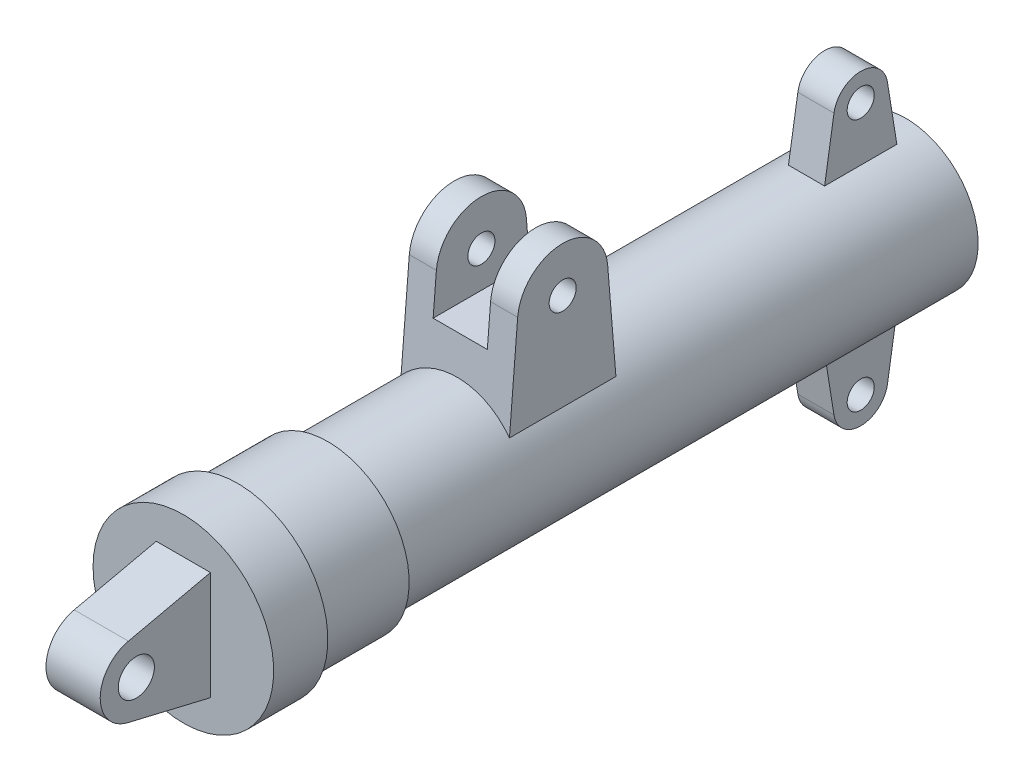
ISO-10303-21;
HEADER;
FILE_DESCRIPTION(('STEP AP214'),'2;1');
FILE_NAME('part.step','',(''),(''),'','','');
FILE_SCHEMA(('AUTOMOTIVE_DESIGN { 1 0 10303 214 1 1 1 1 }'));
ENDSEC;
DATA;
#1=APPLICATION_CONTEXT('core data for automotive mechanical design processes');
#2=APPLICATION_PROTOCOL_DEFINITION('international standard','automotive_design',2000,#1);
#3=PRODUCT_CONTEXT('',#1,'mechanical');
#4=PRODUCT('Part','Part','',(#3));
#5=PRODUCT_RELATED_PRODUCT_CATEGORY('part','',(#4));
#6=PRODUCT_DEFINITION_FORMATION('','',#4);
#7=PRODUCT_DEFINITION_CONTEXT('part definition',#1,'design');
#8=PRODUCT_DEFINITION('design','',#6,#7);
#9=PRODUCT_DEFINITION_SHAPE('','',#8);
#10=(LENGTH_UNIT() NAMED_UNIT(*) SI_UNIT(.MILLI.,.METRE.));
#11=(NAMED_UNIT(*) PLANE_ANGLE_UNIT() SI_UNIT($,.RADIAN.));
#12=(NAMED_UNIT(*) SI_UNIT($,.STERADIAN.) SOLID_ANGLE_UNIT());
#13=UNCERTAINTY_MEASURE_WITH_UNIT(LENGTH_MEASURE(1.E-05),#10,'distance_accuracy_value','');
#14=(GEOMETRIC_REPRESENTATION_CONTEXT(3) GLOBAL_UNCERTAINTY_ASSIGNED_CONTEXT((#13)) GLOBAL_UNIT_ASSIGNED_CONTEXT((#10,
#11,#12)) REPRESENTATION_CONTEXT('',''));
#15=CARTESIAN_POINT('',(0.,0.,0.));
#16=DIRECTION('',(0.,0.,1.));
#17=DIRECTION('',(1.,0.,0.));
#18=AXIS2_PLACEMENT_3D('',#15,#16,#17);
#19=CARTESIAN_POINT('',(10.,-70.,-13.0597014925373));
#20=DIRECTION('',(1.,0.,0.));
#21=DIRECTION('',(0.,0.,-1.));
#22=AXIS2_PLACEMENT_3D('',#19,#20,#21);
#23=PLANE('',#22);
#24=DIRECTION('',(0.,0.,-1.));
#25=VECTOR('',#24,1.);
#26=CARTESIAN_POINT('',(10.,-40.,6.94029850746271));
#27=LINE('',#26,#25);
#28=CARTESIAN_POINT('',(10.,-40.,6.94029850746271));
#29=VERTEX_POINT('',#28);
#30=CARTESIAN_POINT('',(10.,-40.,-33.0597014925373));
#31=VERTEX_POINT('',#30);
#32=EDGE_CURVE('E138',#29,#31,#27,.T.);
#33=ORIENTED_EDGE('',*,*,#32,.F.);
#34=DIRECTION('',(0.,-0.987396752804077,-0.158264501869385));
#35=VECTOR('',#34,1.);
#36=CARTESIAN_POINT('',(10.,-40.,6.94029850746271));
#37=LINE('',#36,#35);
#38=CARTESIAN_POINT('',(10.,-72.3739675280408,1.75124979952386));
#39=VERTEX_POINT('',#38);
#40=EDGE_CURVE('E137',#29,#39,#37,.T.);
#41=ORIENTED_EDGE('',*,*,#40,.T.);
#42=CARTESIAN_POINT('',(10.,-70.,-13.0597014925373));
#43=DIRECTION('',(-1.,0.,0.));
#44=DIRECTION('',(0.,0.,-1.));
#45=AXIS2_PLACEMENT_3D('',#42,#43,#44);
#46=CIRCLE('',#45,15.);
#47=CARTESIAN_POINT('',(10.,-72.3739675280408,-27.8706527845985));
#48=VERTEX_POINT('',#47);
#49=EDGE_CURVE('E130',#48,#39,#46,.T.);
#50=ORIENTED_EDGE('',*,*,#49,.F.);
#51=DIRECTION('',(0.,-0.987396752804077,0.158264501869385));
#52=VECTOR('',#51,1.);
#53=CARTESIAN_POINT('',(10.,-40.,-33.0597014925373));
#54=LINE('',#53,#52);
#55=EDGE_CURVE('E135',#31,#48,#54,.T.);
#56=ORIENTED_EDGE('',*,*,#55,.F.);
#57=EDGE_LOOP('',(#33,#41,#50,#56));
#58=FACE_BOUND('',#57,.T.);
#59=CARTESIAN_POINT('',(10.,-70.,-13.0597014925373));
#60=DIRECTION('',(-1.,0.,0.));
#61=DIRECTION('',(0.,0.,-1.));
#62=AXIS2_PLACEMENT_3D('',#59,#60,#61);
#63=CIRCLE('',#62,7.5);
#64=CARTESIAN_POINT('',(10.,-70.,-20.5597014925373));
#65=VERTEX_POINT('',#64);
#66=EDGE_CURVE('E146',#65,#65,#63,.T.);
#67=ORIENTED_EDGE('',*,*,#66,.T.);
#68=EDGE_LOOP('',(#67));
#69=FACE_BOUND('',#68,.T.);
#70=ADVANCED_FACE('F79',(#58,#69),#23,.T.);
#71=CARTESIAN_POINT('',(-10.,-70.,-13.0597014925373));
#72=DIRECTION('',(1.,0.,0.));
#73=DIRECTION('',(0.,0.,-1.));
#74=AXIS2_PLACEMENT_3D('',#71,#72,#73);
#75=PLANE('',#74);
#76=DIRECTION('',(0.,0.,-1.));
#77=VECTOR('',#76,1.);
#78=CARTESIAN_POINT('',(-10.,-40.,6.94029850746271));
#79=LINE('',#78,#77);
#80=CARTESIAN_POINT('',(-10.,-40.,6.94029850746271));
#81=VERTEX_POINT('',#80);
#82=CARTESIAN_POINT('',(-10.,-40.,-33.0597014925373));
#83=VERTEX_POINT('',#82);
#84=EDGE_CURVE('E145',#81,#83,#79,.T.);
#85=ORIENTED_EDGE('',*,*,#84,.T.);
#86=DIRECTION('',(0.,-0.987396752804077,0.158264501869385));
#87=VECTOR('',#86,1.);
#88=CARTESIAN_POINT('',(-10.,-40.,-33.0597014925373));
#89=LINE('',#88,#87);
#90=CARTESIAN_POINT('',(-10.,-72.3739675280408,-27.8706527845985));
#91=VERTEX_POINT('',#90);
#92=EDGE_CURVE('E150',#83,#91,#89,.T.);
#93=ORIENTED_EDGE('',*,*,#92,.T.);
#94=CARTESIAN_POINT('',(-10.,-70.,-13.0597014925373));
#95=DIRECTION('',(-1.,0.,0.));
#96=DIRECTION('',(0.,0.,-1.));
#97=AXIS2_PLACEMENT_3D('',#94,#95,#96);
#98=CIRCLE('',#97,15.);
#99=CARTESIAN_POINT('',(-10.,-72.3739675280408,1.75124979952386));
#100=VERTEX_POINT('',#99);
#101=EDGE_CURVE('E128',#91,#100,#98,.T.);
#102=ORIENTED_EDGE('',*,*,#101,.T.);
#103=DIRECTION('',(0.,-0.987396752804077,-0.158264501869385));
#104=VECTOR('',#103,1.);
#105=CARTESIAN_POINT('',(-10.,-40.,6.94029850746271));
#106=LINE('',#105,#104);
#107=EDGE_CURVE('E151',#81,#100,#106,.T.);
#108=ORIENTED_EDGE('',*,*,#107,.F.);
#109=EDGE_LOOP('',(#85,#93,#102,#108));
#110=FACE_BOUND('',#109,.T.);
#111=CARTESIAN_POINT('',(-10.,-70.,-13.0597014925373));
#112=DIRECTION('',(-1.,0.,0.));
#113=DIRECTION('',(0.,0.,-1.));
#114=AXIS2_PLACEMENT_3D('',#111,#112,#113);
#115=CIRCLE('',#114,7.5);
#116=CARTESIAN_POINT('',(-10.,-70.,-20.5597014925373));
#117=VERTEX_POINT('',#116);
#118=EDGE_CURVE('E154',#117,#117,#115,.T.);
#119=ORIENTED_EDGE('',*,*,#118,.F.);
#120=EDGE_LOOP('',(#119));
#121=FACE_BOUND('',#120,.T.);
#122=ADVANCED_FACE('F169',(#110,#121),#75,.F.);
#123=CARTESIAN_POINT('',(10.,-40.,6.94029850746271));
#124=DIRECTION('',(0.,-1.,0.));
#125=DIRECTION('',(0.,0.,1.));
#126=AXIS2_PLACEMENT_3D('',#123,#124,#125);
#127=PLANE('',#126);
#128=ORIENTED_EDGE('',*,*,#84,.F.);
#129=DIRECTION('',(-1.,0.,0.));
#130=VECTOR('',#129,1.);
#131=CARTESIAN_POINT('',(10.,-40.,6.94029850746271));
#132=LINE('',#131,#130);
#133=EDGE_CURVE('E100',#29,#81,#132,.T.);
#134=ORIENTED_EDGE('',*,*,#133,.F.);
#135=ORIENTED_EDGE('',*,*,#32,.T.);
#136=DIRECTION('',(-1.,0.,0.));
#137=VECTOR('',#136,1.);
#138=CARTESIAN_POINT('',(10.,-40.,-33.0597014925373));
#139=LINE('',#138,#137);
#140=EDGE_CURVE('E13',#31,#83,#139,.T.);
#141=ORIENTED_EDGE('',*,*,#140,.T.);
#142=EDGE_LOOP('',(#128,#134,#135,#141));
#143=FACE_BOUND('',#142,.T.);
#144=ADVANCED_FACE('F85',(#143),#127,.F.);
#145=CARTESIAN_POINT('',(10.,-40.,-33.0597014925373));
#146=DIRECTION('',(0.,0.158264501869385,0.987396752804077));
#147=DIRECTION('',(0.,0.987396752804077,-0.158264501869385));
#148=AXIS2_PLACEMENT_3D('',#145,#146,#147);
#149=PLANE('',#148);
#150=ORIENTED_EDGE('',*,*,#92,.F.);
#151=ORIENTED_EDGE('',*,*,#140,.F.);
#152=ORIENTED_EDGE('',*,*,#55,.T.);
#153=DIRECTION('',(-1.,0.,0.));
#154=VECTOR('',#153,1.);
#155=CARTESIAN_POINT('',(10.,-72.3739675280408,-27.8706527845985));
#156=LINE('',#155,#154);
#157=EDGE_CURVE('E90',#48,#91,#156,.T.);
#158=ORIENTED_EDGE('',*,*,#157,.T.);
#159=EDGE_LOOP('',(#150,#151,#152,#158));
#160=FACE_BOUND('',#159,.T.);
#161=ADVANCED_FACE('F132',(#160),#149,.F.);
#162=CARTESIAN_POINT('',(10.,-70.,-13.0597014925373));
#163=DIRECTION('',(-1.,0.,0.));
#164=DIRECTION('',(0.,0.,1.));
#165=AXIS2_PLACEMENT_3D('',#162,#163,#164);
#166=CYLINDRICAL_SURFACE('',#165,15.);
#167=ORIENTED_EDGE('',*,*,#101,.F.);
#168=ORIENTED_EDGE('',*,*,#157,.F.);
#169=ORIENTED_EDGE('',*,*,#49,.T.);
#170=DIRECTION('',(-1.,0.,0.));
#171=VECTOR('',#170,1.);
#172=CARTESIAN_POINT('',(10.,-72.3739675280408,1.75124979952386));
#173=LINE('',#172,#171);
#174=EDGE_CURVE('E114',#39,#100,#173,.T.);
#175=ORIENTED_EDGE('',*,*,#174,.T.);
#176=EDGE_LOOP('',(#167,#168,#169,#175));
#177=FACE_BOUND('',#176,.T.);
#178=ADVANCED_FACE('F124',(#177),#166,.T.);
#179=CARTESIAN_POINT('',(10.,-40.,6.94029850746271));
#180=DIRECTION('',(0.,-0.158264501869385,0.987396752804077));
#181=DIRECTION('',(0.,0.987396752804077,0.158264501869385));
#182=AXIS2_PLACEMENT_3D('',#179,#180,#181);
#183=PLANE('',#182);
#184=ORIENTED_EDGE('',*,*,#107,.T.);
#185=ORIENTED_EDGE('',*,*,#174,.F.);
#186=ORIENTED_EDGE('',*,*,#40,.F.);
#187=ORIENTED_EDGE('',*,*,#133,.T.);
#188=EDGE_LOOP('',(#184,#185,#186,#187));
#189=FACE_BOUND('',#188,.T.);
#190=ADVANCED_FACE('F163',(#189),#183,.T.);
#191=CARTESIAN_POINT('',(10.,-70.,-13.0597014925373));
#192=DIRECTION('',(-1.,0.,0.));
#193=DIRECTION('',(0.,0.,1.));
#194=AXIS2_PLACEMENT_3D('',#191,#192,#193);
#195=CYLINDRICAL_SURFACE('',#194,7.5);
#196=ORIENTED_EDGE('',*,*,#66,.F.);
#197=EDGE_LOOP('',(#196));
#198=FACE_BOUND('',#197,.T.);
#199=ORIENTED_EDGE('',*,*,#118,.T.);
#200=EDGE_LOOP('',(#199));
#201=FACE_BOUND('',#200,.T.);
#202=ADVANCED_FACE('F161',(#198,#201),#195,.F.);
#203=CLOSED_SHELL('',(#70,#122,#144,#161,#178,#190,#202));
#204=MANIFOLD_SOLID_BREP('B2',#203);
#205=CARTESIAN_POINT('',(10.,70.,-13.0597014925373));
#206=DIRECTION('',(1.,0.,0.));
#207=DIRECTION('',(0.,0.,-1.));
#208=AXIS2_PLACEMENT_3D('',#205,#206,#207);
#209=PLANE('',#208);
#210=DIRECTION('',(0.,0.,-1.));
#211=VECTOR('',#210,1.);
#212=CARTESIAN_POINT('',(10.,40.,6.94029850746271));
#213=LINE('',#212,#211);
#214=CARTESIAN_POINT('',(10.,40.,6.94029850746271));
#215=VERTEX_POINT('',#214);
#216=CARTESIAN_POINT('',(10.,40.,-33.0597014925373));
#217=VERTEX_POINT('',#216);
#218=EDGE_CURVE('E283',#215,#217,#213,.T.);
#219=ORIENTED_EDGE('',*,*,#218,.T.);
#220=DIRECTION('',(0.,0.987396752804077,0.158264501869385));
#221=VECTOR('',#220,1.);
#222=CARTESIAN_POINT('',(10.,40.,-33.0597014925373));
#223=LINE('',#222,#221);
#224=CARTESIAN_POINT('',(10.,72.3739675280408,-27.8706527845985));
#225=VERTEX_POINT('',#224);
#226=EDGE_CURVE('E280',#217,#225,#223,.T.);
#227=ORIENTED_EDGE('',*,*,#226,.T.);
#228=CARTESIAN_POINT('',(10.,70.,-13.0597014925373));
#229=DIRECTION('',(1.,0.,0.));
#230=DIRECTION('',(0.,0.,-1.));
#231=AXIS2_PLACEMENT_3D('',#228,#229,#230);
#232=CIRCLE('',#231,15.);
#233=CARTESIAN_POINT('',(10.,72.3739675280408,1.75124979952386));
#234=VERTEX_POINT('',#233);
#235=EDGE_CURVE('E282',#225,#234,#232,.T.);
#236=ORIENTED_EDGE('',*,*,#235,.T.);
#237=DIRECTION('',(0.,0.987396752804077,-0.158264501869385));
#238=VECTOR('',#237,1.);
#239=CARTESIAN_POINT('',(10.,40.,6.94029850746271));
#240=LINE('',#239,#238);
#241=EDGE_CURVE('E291',#215,#234,#240,.T.);
#242=ORIENTED_EDGE('',*,*,#241,.F.);
#243=EDGE_LOOP('',(#219,#227,#236,#242));
#244=FACE_BOUND('',#243,.T.);
#245=CARTESIAN_POINT('',(10.,70.,-13.0597014925373));
#246=DIRECTION('',(1.,0.,0.));
#247=DIRECTION('',(0.,0.,-1.));
#248=AXIS2_PLACEMENT_3D('',#245,#246,#247);
#249=CIRCLE('',#248,7.5);
#250=CARTESIAN_POINT('',(10.,70.,-20.5597014925373));
#251=VERTEX_POINT('',#250);
#252=EDGE_CURVE('E299',#251,#251,#249,.T.);
#253=ORIENTED_EDGE('',*,*,#252,.F.);
#254=EDGE_LOOP('',(#253));
#255=FACE_BOUND('',#254,.T.);
#256=ADVANCED_FACE('F232',(#244,#255),#209,.T.);
#257=CARTESIAN_POINT('',(-10.,70.,-13.0597014925373));
#258=DIRECTION('',(1.,0.,0.));
#259=DIRECTION('',(0.,0.,-1.));
#260=AXIS2_PLACEMENT_3D('',#257,#258,#259);
#261=PLANE('',#260);
#262=DIRECTION('',(0.,0.,-1.));
#263=VECTOR('',#262,1.);
#264=CARTESIAN_POINT('',(-10.,40.,6.94029850746271));
#265=LINE('',#264,#263);
#266=CARTESIAN_POINT('',(-10.,40.,6.94029850746271));
#267=VERTEX_POINT('',#266);
#268=CARTESIAN_POINT('',(-10.,40.,-33.0597014925373));
#269=VERTEX_POINT('',#268);
#270=EDGE_CURVE('E297',#267,#269,#265,.T.);
#271=ORIENTED_EDGE('',*,*,#270,.F.);
#272=DIRECTION('',(0.,0.987396752804077,-0.158264501869385));
#273=VECTOR('',#272,1.);
#274=CARTESIAN_POINT('',(-10.,40.,6.94029850746271));
#275=LINE('',#274,#273);
#276=CARTESIAN_POINT('',(-10.,72.3739675280408,1.75124979952386));
#277=VERTEX_POINT('',#276);
#278=EDGE_CURVE('E302',#267,#277,#275,.T.);
#279=ORIENTED_EDGE('',*,*,#278,.T.);
#280=CARTESIAN_POINT('',(-10.,70.,-13.0597014925373));
#281=DIRECTION('',(1.,0.,0.));
#282=DIRECTION('',(0.,0.,-1.));
#283=AXIS2_PLACEMENT_3D('',#280,#281,#282);
#284=CIRCLE('',#283,15.);
#285=CARTESIAN_POINT('',(-10.,72.3739675280408,-27.8706527845985));
#286=VERTEX_POINT('',#285);
#287=EDGE_CURVE('E305',#286,#277,#284,.T.);
#288=ORIENTED_EDGE('',*,*,#287,.F.);
#289=DIRECTION('',(0.,0.987396752804077,0.158264501869385));
#290=VECTOR('',#289,1.);
#291=CARTESIAN_POINT('',(-10.,40.,-33.0597014925373));
#292=LINE('',#291,#290);
#293=EDGE_CURVE('E287',#269,#286,#292,.T.);
#294=ORIENTED_EDGE('',*,*,#293,.F.);
#295=EDGE_LOOP('',(#271,#279,#288,#294));
#296=FACE_BOUND('',#295,.T.);
#297=CARTESIAN_POINT('',(-10.,70.,-13.0597014925373));
#298=DIRECTION('',(1.,0.,0.));
#299=DIRECTION('',(0.,0.,-1.));
#300=AXIS2_PLACEMENT_3D('',#297,#298,#299);
#301=CIRCLE('',#300,7.5);
#302=CARTESIAN_POINT('',(-10.,70.,-20.5597014925373));
#303=VERTEX_POINT('',#302);
#304=EDGE_CURVE('E309',#303,#303,#301,.T.);
#305=ORIENTED_EDGE('',*,*,#304,.T.);
#306=EDGE_LOOP('',(#305));
#307=FACE_BOUND('',#306,.T.);
#308=ADVANCED_FACE('F317',(#296,#307),#261,.F.);
#309=CARTESIAN_POINT('',(10.,40.,6.94029850746271));
#310=DIRECTION('',(0.,1.,0.));
#311=DIRECTION('',(0.,0.,1.));
#312=AXIS2_PLACEMENT_3D('',#309,#310,#311);
#313=PLANE('',#312);
#314=ORIENTED_EDGE('',*,*,#270,.T.);
#315=DIRECTION('',(-1.,0.,0.));
#316=VECTOR('',#315,1.);
#317=CARTESIAN_POINT('',(10.,40.,-33.0597014925373));
#318=LINE('',#317,#316);
#319=EDGE_CURVE('E77',#217,#269,#318,.T.);
#320=ORIENTED_EDGE('',*,*,#319,.F.);
#321=ORIENTED_EDGE('',*,*,#218,.F.);
#322=DIRECTION('',(-1.,0.,0.));
#323=VECTOR('',#322,1.);
#324=CARTESIAN_POINT('',(10.,40.,6.94029850746271));
#325=LINE('',#324,#323);
#326=EDGE_CURVE('E253',#215,#267,#325,.T.);
#327=ORIENTED_EDGE('',*,*,#326,.T.);
#328=EDGE_LOOP('',(#314,#320,#321,#327));
#329=FACE_BOUND('',#328,.T.);
#330=ADVANCED_FACE('F237',(#329),#313,.F.);
#331=CARTESIAN_POINT('',(10.,40.,-33.0597014925373));
#332=DIRECTION('',(0.,-0.158264501869385,0.987396752804077));
#333=DIRECTION('',(0.,-0.987396752804077,-0.158264501869385));
#334=AXIS2_PLACEMENT_3D('',#331,#332,#333);
#335=PLANE('',#334);
#336=ORIENTED_EDGE('',*,*,#293,.T.);
#337=DIRECTION('',(-1.,0.,0.));
#338=VECTOR('',#337,1.);
#339=CARTESIAN_POINT('',(10.,72.3739675280408,-27.8706527845985));
#340=LINE('',#339,#338);
#341=EDGE_CURVE('E242',#225,#286,#340,.T.);
#342=ORIENTED_EDGE('',*,*,#341,.F.);
#343=ORIENTED_EDGE('',*,*,#226,.F.);
#344=ORIENTED_EDGE('',*,*,#319,.T.);
#345=EDGE_LOOP('',(#336,#342,#343,#344));
#346=FACE_BOUND('',#345,.T.);
#347=ADVANCED_FACE('F286',(#346),#335,.F.);
#348=CARTESIAN_POINT('',(10.,70.,-13.0597014925373));
#349=DIRECTION('',(-1.,0.,0.));
#350=DIRECTION('',(0.,0.,1.));
#351=AXIS2_PLACEMENT_3D('',#348,#349,#350);
#352=CYLINDRICAL_SURFACE('',#351,15.);
#353=ORIENTED_EDGE('',*,*,#287,.T.);
#354=DIRECTION('',(-1.,0.,0.));
#355=VECTOR('',#354,1.);
#356=CARTESIAN_POINT('',(10.,72.3739675280408,1.75124979952386));
#357=LINE('',#356,#355);
#358=EDGE_CURVE('E266',#234,#277,#357,.T.);
#359=ORIENTED_EDGE('',*,*,#358,.F.);
#360=ORIENTED_EDGE('',*,*,#235,.F.);
#361=ORIENTED_EDGE('',*,*,#341,.T.);
#362=EDGE_LOOP('',(#353,#359,#360,#361));
#363=FACE_BOUND('',#362,.T.);
#364=ADVANCED_FACE('F295',(#363),#352,.T.);
#365=CARTESIAN_POINT('',(10.,40.,6.94029850746271));
#366=DIRECTION('',(0.,0.158264501869385,0.987396752804077));
#367=DIRECTION('',(0.,-0.987396752804077,0.158264501869385));
#368=AXIS2_PLACEMENT_3D('',#365,#366,#367);
#369=PLANE('',#368);
#370=ORIENTED_EDGE('',*,*,#278,.F.);
#371=ORIENTED_EDGE('',*,*,#326,.F.);
#372=ORIENTED_EDGE('',*,*,#241,.T.);
#373=ORIENTED_EDGE('',*,*,#358,.T.);
#374=EDGE_LOOP('',(#370,#371,#372,#373));
#375=FACE_BOUND('',#374,.T.);
#376=ADVANCED_FACE('F330',(#375),#369,.T.);
#377=CARTESIAN_POINT('',(10.,70.,-13.0597014925373));
#378=DIRECTION('',(-1.,0.,0.));
#379=DIRECTION('',(0.,0.,1.));
#380=AXIS2_PLACEMENT_3D('',#377,#378,#379);
#381=CYLINDRICAL_SURFACE('',#380,7.5);
#382=ORIENTED_EDGE('',*,*,#252,.T.);
#383=EDGE_LOOP('',(#382));
#384=FACE_BOUND('',#383,.T.);
#385=ORIENTED_EDGE('',*,*,#304,.F.);
#386=EDGE_LOOP('',(#385));
#387=FACE_BOUND('',#386,.T.);
#388=ADVANCED_FACE('F316',(#384,#387),#381,.F.);
#389=CLOSED_SHELL('',(#256,#308,#330,#347,#364,#376,#388));
#390=MANIFOLD_SOLID_BREP('B7',#389);
#391=CARTESIAN_POINT('',(30.,20.,141.940298507463));
#392=DIRECTION('',(0.,-0.0816633199329574,0.996659973199249));
#393=DIRECTION('',(0.,-0.996659973199249,-0.0816633199329574));
#394=AXIS2_PLACEMENT_3D('',#391,#392,#393);
#395=PLANE('',#394);
#396=DIRECTION('',(0.,0.996659973199249,0.0816633199329574));
#397=VECTOR('',#396,1.);
#398=CARTESIAN_POINT('',(-15.,20.,141.940298507463));
#399=LINE('',#398,#397);
#400=CARTESIAN_POINT('',(-15.,60.,145.217778174709));
#401=VERTEX_POINT('',#400);
#402=CARTESIAN_POINT('',(-15.,82.0415829983239,147.023799177481));
#403=VERTEX_POINT('',#402);
#404=EDGE_CURVE('E510',#401,#403,#399,.T.);
#405=ORIENTED_EDGE('',*,*,#404,.F.);
#406=DIRECTION('',(1.,0.,0.));
#407=VECTOR('',#406,1.);
#408=CARTESIAN_POINT('',(30.,60.,145.217778174709));
#409=LINE('',#408,#407);
#410=CARTESIAN_POINT('',(15.,60.,145.217778174709));
#411=VERTEX_POINT('',#410);
#412=EDGE_CURVE('E507',#401,#411,#409,.T.);
#413=ORIENTED_EDGE('',*,*,#412,.T.);
#414=DIRECTION('',(0.,0.996659973199249,0.0816633199329574));
#415=VECTOR('',#414,1.);
#416=CARTESIAN_POINT('',(15.,20.,141.940298507463));
#417=LINE('',#416,#415);
#418=CARTESIAN_POINT('',(15.,82.0415829983239,147.023799177481));
#419=VERTEX_POINT('',#418);
#420=EDGE_CURVE('E489',#411,#419,#417,.T.);
#421=ORIENTED_EDGE('',*,*,#420,.T.);
#422=DIRECTION('',(-1.,0.,0.));
#423=VECTOR('',#422,1.);
#424=CARTESIAN_POINT('',(30.,82.0415829983239,147.023799177481));
#425=LINE('',#424,#423);
#426=CARTESIAN_POINT('',(30.,82.0415829983239,147.023799177481));
#427=VERTEX_POINT('',#426);
#428=EDGE_CURVE('E538',#427,#419,#425,.T.);
#429=ORIENTED_EDGE('',*,*,#428,.F.);
#430=DIRECTION('',(0.,0.996659973199249,0.0816633199329574));
#431=VECTOR('',#430,1.);
#432=CARTESIAN_POINT('',(30.,20.,141.940298507463));
#433=LINE('',#432,#431);
#434=CARTESIAN_POINT('',(30.,26.4575131106459,142.469407705491));
#435=VERTEX_POINT('',#434);
#436=EDGE_CURVE('E522',#435,#427,#433,.T.);
#437=ORIENTED_EDGE('',*,*,#436,.F.);
#438=CARTESIAN_POINT('',(0.,0.,140.30155867384));
#439=DIRECTION('',(0.,-0.0816633199329574,0.996659973199249));
#440=DIRECTION('',(0.,-0.996659973199249,-0.0816633199329574));
#441=AXIS2_PLACEMENT_3D('',#438,#439,#440);
#442=ELLIPSE('',#441,40.13404879861,40.);
#443=CARTESIAN_POINT('',(-30.,26.4575131106459,142.469407705491));
#444=VERTEX_POINT('',#443);
#445=EDGE_CURVE('E405',#444,#435,#442,.F.);
#446=ORIENTED_EDGE('',*,*,#445,.F.);
#447=DIRECTION('',(0.,0.996659973199249,0.0816633199329574));
#448=VECTOR('',#447,1.);
#449=CARTESIAN_POINT('',(-30.,20.,141.940298507463));
#450=LINE('',#449,#448);
#451=CARTESIAN_POINT('',(-30.,82.0415829983239,147.023799177481));
#452=VERTEX_POINT('',#451);
#453=EDGE_CURVE('E523',#444,#452,#450,.T.);
#454=ORIENTED_EDGE('',*,*,#453,.T.);
#455=EDGE_CURVE('E541',#403,#452,#425,.T.);
#456=ORIENTED_EDGE('',*,*,#455,.F.);
#457=EDGE_LOOP('',(#405,#413,#421,#429,#437,#446,#454,#456));
#458=FACE_BOUND('',#457,.T.);
#459=ADVANCED_FACE('F377',(#458),#395,.F.);
#460=CARTESIAN_POINT('',(30.,20.,201.940298507463));
#461=DIRECTION('',(0.,0.0816633199329574,0.996659973199249));
#462=DIRECTION('',(0.,-0.996659973199249,0.0816633199329574));
#463=AXIS2_PLACEMENT_3D('',#460,#461,#462);
#464=PLANE('',#463);
#465=DIRECTION('',(1.,0.,0.));
#466=VECTOR('',#465,1.);
#467=CARTESIAN_POINT('',(30.,60.,198.662818840217));
#468=LINE('',#467,#466);
#469=CARTESIAN_POINT('',(-15.,60.,198.662818840217));
#470=VERTEX_POINT('',#469);
#471=CARTESIAN_POINT('',(15.,60.,198.662818840217));
#472=VERTEX_POINT('',#471);
#473=EDGE_CURVE('E235',#470,#472,#468,.T.);
#474=ORIENTED_EDGE('',*,*,#473,.F.);
#475=DIRECTION('',(0.,0.996659973199249,-0.0816633199329574));
#476=VECTOR('',#475,1.);
#477=CARTESIAN_POINT('',(-15.,20.,201.940298507463));
#478=LINE('',#477,#476);
#479=CARTESIAN_POINT('',(-15.,82.0415829983239,196.856797837444));
#480=VERTEX_POINT('',#479);
#481=EDGE_CURVE('E504',#470,#480,#478,.T.);
#482=ORIENTED_EDGE('',*,*,#481,.T.);
#483=DIRECTION('',(-1.,0.,0.));
#484=VECTOR('',#483,1.);
#485=CARTESIAN_POINT('',(30.,82.0415829983239,196.856797837444));
#486=LINE('',#485,#484);
#487=CARTESIAN_POINT('',(-30.,82.0415829983239,196.856797837444));
#488=VERTEX_POINT('',#487);
#489=EDGE_CURVE('E543',#480,#488,#486,.T.);
#490=ORIENTED_EDGE('',*,*,#489,.T.);
#491=DIRECTION('',(0.,0.996659973199249,-0.0816633199329574));
#492=VECTOR('',#491,1.);
#493=CARTESIAN_POINT('',(-30.,20.,201.940298507463));
#494=LINE('',#493,#492);
#495=CARTESIAN_POINT('',(-30.,26.4575131106459,201.411189309435));
#496=VERTEX_POINT('',#495);
#497=EDGE_CURVE('E513',#496,#488,#494,.T.);
#498=ORIENTED_EDGE('',*,*,#497,.F.);
#499=CARTESIAN_POINT('',(0.,0.,203.579038341086));
#500=DIRECTION('',(0.,0.0816633199329574,0.996659973199249));
#501=DIRECTION('',(0.,0.996659973199249,-0.0816633199329574));
#502=AXIS2_PLACEMENT_3D('',#499,#500,#501);
#503=ELLIPSE('',#502,40.13404879861,40.);
#504=CARTESIAN_POINT('',(30.,26.4575131106459,201.411189309435));
#505=VERTEX_POINT('',#504);
#506=EDGE_CURVE('E540',#496,#505,#503,.F.);
#507=ORIENTED_EDGE('',*,*,#506,.T.);
#508=DIRECTION('',(0.,0.996659973199249,-0.0816633199329574));
#509=VECTOR('',#508,1.);
#510=CARTESIAN_POINT('',(30.,20.,201.940298507463));
#511=LINE('',#510,#509);
#512=CARTESIAN_POINT('',(30.,82.0415829983239,196.856797837444));
#513=VERTEX_POINT('',#512);
#514=EDGE_CURVE('E517',#505,#513,#511,.T.);
#515=ORIENTED_EDGE('',*,*,#514,.T.);
#516=CARTESIAN_POINT('',(15.,82.0415829983239,196.856797837444));
#517=VERTEX_POINT('',#516);
#518=EDGE_CURVE('E494',#513,#517,#486,.T.);
#519=ORIENTED_EDGE('',*,*,#518,.T.);
#520=DIRECTION('',(0.,0.996659973199249,-0.0816633199329574));
#521=VECTOR('',#520,1.);
#522=CARTESIAN_POINT('',(15.,20.,201.940298507463));
#523=LINE('',#522,#521);
#524=EDGE_CURVE('E393',#472,#517,#523,.T.);
#525=ORIENTED_EDGE('',*,*,#524,.F.);
#526=EDGE_LOOP('',(#474,#482,#490,#498,#507,#515,#519,#525));
#527=FACE_BOUND('',#526,.T.);
#528=ADVANCED_FACE('F492',(#527),#464,.T.);
#529=CARTESIAN_POINT('',(30.,80.,171.940298507463));
#530=DIRECTION('',(-1.,0.,0.));
#531=DIRECTION('',(0.,0.,1.));
#532=AXIS2_PLACEMENT_3D('',#529,#530,#531);
#533=CYLINDRICAL_SURFACE('',#532,25.);
#534=CARTESIAN_POINT('',(-15.,80.,171.940298507463));
#535=DIRECTION('',(1.,0.,0.));
#536=DIRECTION('',(0.,0.,-1.));
#537=AXIS2_PLACEMENT_3D('',#534,#535,#536);
#538=CIRCLE('',#537,25.);
#539=EDGE_CURVE('E502',#403,#480,#538,.T.);
#540=ORIENTED_EDGE('',*,*,#539,.F.);
#541=ORIENTED_EDGE('',*,*,#455,.T.);
#542=CARTESIAN_POINT('',(-30.,80.,171.940298507463));
#543=DIRECTION('',(1.,0.,0.));
#544=DIRECTION('',(0.,0.,-1.));
#545=AXIS2_PLACEMENT_3D('',#542,#543,#544);
#546=CIRCLE('',#545,25.);
#547=EDGE_CURVE('E530',#452,#488,#546,.T.);
#548=ORIENTED_EDGE('',*,*,#547,.T.);
#549=ORIENTED_EDGE('',*,*,#489,.F.);
#550=EDGE_LOOP('',(#540,#541,#548,#549));
#551=FACE_BOUND('',#550,.T.);
#552=ADVANCED_FACE('F641',(#551),#533,.T.);
#553=CARTESIAN_POINT('',(30.,80.,171.940298507463));
#554=DIRECTION('',(-1.,0.,0.));
#555=DIRECTION('',(0.,0.,1.));
#556=AXIS2_PLACEMENT_3D('',#553,#554,#555);
#557=CYLINDRICAL_SURFACE('',#556,7.50000000000001);
#558=CARTESIAN_POINT('',(-30.,80.,171.940298507463));
#559=DIRECTION('',(1.,0.,0.));
#560=DIRECTION('',(0.,0.,-1.));
#561=AXIS2_PLACEMENT_3D('',#558,#559,#560);
#562=CIRCLE('',#561,7.50000000000001);
#563=CARTESIAN_POINT('',(-30.,80.,164.440298507463));
#564=VERTEX_POINT('',#563);
#565=EDGE_CURVE('E512',#564,#564,#562,.T.);
#566=ORIENTED_EDGE('',*,*,#565,.F.);
#567=EDGE_LOOP('',(#566));
#568=FACE_BOUND('',#567,.T.);
#569=CARTESIAN_POINT('',(-15.,80.,171.940298507463));
#570=DIRECTION('',(1.,0.,0.));
#571=DIRECTION('',(0.,0.,-1.));
#572=AXIS2_PLACEMENT_3D('',#569,#570,#571);
#573=CIRCLE('',#572,7.50000000000001);
#574=CARTESIAN_POINT('',(-15.,80.,164.440298507463));
#575=VERTEX_POINT('',#574);
#576=EDGE_CURVE('E499',#575,#575,#573,.T.);
#577=ORIENTED_EDGE('',*,*,#576,.T.);
#578=EDGE_LOOP('',(#577));
#579=FACE_BOUND('',#578,.T.);
#580=ADVANCED_FACE('F633',(#568,#579),#557,.F.);
#581=CARTESIAN_POINT('',(0.,0.,336.940298507463));
#582=DIRECTION('',(0.,0.,-1.));
#583=DIRECTION('',(-1.,0.,0.));
#584=AXIS2_PLACEMENT_3D('',#581,#582,#583);
#585=CYLINDRICAL_SURFACE('',#584,40.);
#586=CARTESIAN_POINT('',(0.,0.,271.940298507463));
#587=DIRECTION('',(0.,0.,-1.));
#588=DIRECTION('',(-1.,0.,0.));
#589=AXIS2_PLACEMENT_3D('',#586,#587,#588);
#590=CIRCLE('',#589,40.);
#591=CARTESIAN_POINT('',(-40.,0.,271.940298507463));
#592=VERTEX_POINT('',#591);
#593=EDGE_CURVE('E598',#592,#592,#590,.T.);
#594=ORIENTED_EDGE('',*,*,#593,.T.);
#595=EDGE_LOOP('',(#594));
#596=FACE_BOUND('',#595,.T.);
#597=CARTESIAN_POINT('',(0.,0.,-48.0597014925373));
#598=DIRECTION('',(0.,0.,-1.));
#599=DIRECTION('',(-1.,0.,0.));
#600=AXIS2_PLACEMENT_3D('',#597,#598,#599);
#601=CIRCLE('',#600,40.);
#602=CARTESIAN_POINT('',(-40.,0.,-48.0597014925373));
#603=VERTEX_POINT('',#602);
#604=EDGE_CURVE('E594',#603,#603,#601,.T.);
#605=ORIENTED_EDGE('',*,*,#604,.F.);
#606=EDGE_LOOP('',(#605));
#607=FACE_BOUND('',#606,.T.);
#608=DIRECTION('',(0.,0.,-1.));
#609=VECTOR('',#608,1.);
#610=CARTESIAN_POINT('',(-30.,26.4575131106459,336.940298507463));
#611=LINE('',#610,#609);
#612=EDGE_CURVE('E624',#496,#444,#611,.T.);
#613=ORIENTED_EDGE('',*,*,#612,.T.);
#614=ORIENTED_EDGE('',*,*,#445,.T.);
#615=DIRECTION('',(0.,0.,-1.));
#616=VECTOR('',#615,1.);
#617=CARTESIAN_POINT('',(30.,26.4575131106459,336.940298507463));
#618=LINE('',#617,#616);
#619=EDGE_CURVE('E390',#505,#435,#618,.T.);
#620=ORIENTED_EDGE('',*,*,#619,.F.);
#621=ORIENTED_EDGE('',*,*,#506,.F.);
#622=EDGE_LOOP('',(#613,#614,#620,#621));
#623=FACE_BOUND('',#622,.T.);
#624=ADVANCED_FACE('F697',(#596,#607,#623),#585,.T.);
#625=CARTESIAN_POINT('',(0.,0.,336.940298507463));
#626=DIRECTION('',(0.,0.,-1.));
#627=DIRECTION('',(-1.,0.,0.));
#628=AXIS2_PLACEMENT_3D('',#625,#626,#627);
#629=CYLINDRICAL_SURFACE('',#628,35.);
#630=CARTESIAN_POINT('',(0.,0.,-43.0597014925373));
#631=DIRECTION('',(0.,0.,-1.));
#632=DIRECTION('',(-1.,0.,0.));
#633=AXIS2_PLACEMENT_3D('',#630,#631,#632);
#634=CIRCLE('',#633,35.);
#635=CARTESIAN_POINT('',(-35.,0.,-43.0597014925373));
#636=VERTEX_POINT('',#635);
#637=EDGE_CURVE('E588',#636,#636,#634,.T.);
#638=ORIENTED_EDGE('',*,*,#637,.T.);
#639=EDGE_LOOP('',(#638));
#640=FACE_BOUND('',#639,.T.);
#641=CARTESIAN_POINT('',(0.,0.,336.940298507463));
#642=DIRECTION('',(0.,0.,-1.));
#643=DIRECTION('',(-1.,0.,0.));
#644=AXIS2_PLACEMENT_3D('',#641,#642,#643);
#645=CIRCLE('',#644,35.);
#646=CARTESIAN_POINT('',(-35.,0.,336.940298507463));
#647=VERTEX_POINT('',#646);
#648=EDGE_CURVE('E581',#647,#647,#645,.T.);
#649=ORIENTED_EDGE('',*,*,#648,.F.);
#650=EDGE_LOOP('',(#649));
#651=FACE_BOUND('',#650,.T.);
#652=DIRECTION('',(0.,0.,-1.));
#653=VECTOR('',#652,1.);
#654=CARTESIAN_POINT('',(28.7228132326901,20.,336.940298507463));
#655=LINE('',#654,#653);
#656=CARTESIAN_POINT('',(28.7228132326901,20.,141.940298507463));
#657=VERTEX_POINT('',#656);
#658=CARTESIAN_POINT('',(28.7228132326901,20.,201.940298507463));
#659=VERTEX_POINT('',#658);
#660=EDGE_CURVE('E618',#657,#659,#655,.F.);
#661=ORIENTED_EDGE('',*,*,#660,.F.);
#662=CARTESIAN_POINT('',(0.,0.,140.30155867384));
#663=DIRECTION('',(0.,-0.0816633199329574,0.996659973199249));
#664=DIRECTION('',(0.,-0.996659973199249,-0.0816633199329574));
#665=AXIS2_PLACEMENT_3D('',#662,#663,#664);
#666=ELLIPSE('',#665,35.1172926987838,35.);
#667=CARTESIAN_POINT('',(-28.7228132326901,20.,141.940298507463));
#668=VERTEX_POINT('',#667);
#669=EDGE_CURVE('E625',#657,#668,#666,.T.);
#670=ORIENTED_EDGE('',*,*,#669,.T.);
#671=DIRECTION('',(0.,0.,-1.));
#672=VECTOR('',#671,1.);
#673=CARTESIAN_POINT('',(-28.7228132326901,20.,336.940298507463));
#674=LINE('',#673,#672);
#675=CARTESIAN_POINT('',(-28.7228132326901,20.,201.940298507463));
#676=VERTEX_POINT('',#675);
#677=EDGE_CURVE('E617',#676,#668,#674,.T.);
#678=ORIENTED_EDGE('',*,*,#677,.F.);
#679=CARTESIAN_POINT('',(0.,0.,203.579038341086));
#680=DIRECTION('',(0.,0.0816633199329574,0.996659973199249));
#681=DIRECTION('',(0.,0.996659973199249,-0.0816633199329574));
#682=AXIS2_PLACEMENT_3D('',#679,#680,#681);
#683=ELLIPSE('',#682,35.1172926987838,35.);
#684=EDGE_CURVE('E612',#659,#676,#683,.T.);
#685=ORIENTED_EDGE('',*,*,#684,.F.);
#686=EDGE_LOOP('',(#661,#670,#678,#685));
#687=FACE_BOUND('',#686,.T.);
#688=ADVANCED_FACE('F696',(#640,#651,#687),#629,.F.);
#689=CARTESIAN_POINT('',(0.,0.,351.940298507463));
#690=DIRECTION('',(0.,0.,1.));
#691=DIRECTION('',(1.,0.,0.));
#692=AXIS2_PLACEMENT_3D('',#689,#690,#691);
#693=PLANE('',#692);
#694=CARTESIAN_POINT('',(0.,0.,351.940298507463));
#695=DIRECTION('',(0.,0.,-1.));
#696=DIRECTION('',(-1.,0.,0.));
#697=AXIS2_PLACEMENT_3D('',#694,#695,#696);
#698=CIRCLE('',#697,50.);
#699=CARTESIAN_POINT('',(-50.,0.,351.940298507463));
#700=VERTEX_POINT('',#699);
#701=EDGE_CURVE('E608',#700,#700,#698,.T.);
#702=ORIENTED_EDGE('',*,*,#701,.F.);
#703=EDGE_LOOP('',(#702));
#704=FACE_BOUND('',#703,.T.);
#705=DIRECTION('',(-1.,0.,0.));
#706=VECTOR('',#705,1.);
#707=CARTESIAN_POINT('',(15.,-30.3028146793223,351.940298507463));
#708=LINE('',#707,#706);
#709=CARTESIAN_POINT('',(15.,-30.3028146793223,351.940298507463));
#710=VERTEX_POINT('',#709);
#711=CARTESIAN_POINT('',(-15.,-30.3028146793223,351.940298507463));
#712=VERTEX_POINT('',#711);
#713=EDGE_CURVE('E579',#710,#712,#708,.T.);
#714=ORIENTED_EDGE('',*,*,#713,.T.);
#715=DIRECTION('',(0.,1.,0.));
#716=VECTOR('',#715,1.);
#717=CARTESIAN_POINT('',(-15.,29.6971853206777,351.940298507463));
#718=LINE('',#717,#716);
#719=CARTESIAN_POINT('',(-15.,29.6971853206777,351.940298507463));
#720=VERTEX_POINT('',#719);
#721=EDGE_CURVE('E570',#712,#720,#718,.T.);
#722=ORIENTED_EDGE('',*,*,#721,.T.);
#723=DIRECTION('',(-1.,0.,0.));
#724=VECTOR('',#723,1.);
#725=CARTESIAN_POINT('',(15.,29.6971853206777,351.940298507463));
#726=LINE('',#725,#724);
#727=CARTESIAN_POINT('',(15.,29.6971853206777,351.940298507463));
#728=VERTEX_POINT('',#727);
#729=EDGE_CURVE('E576',#728,#720,#726,.T.);
#730=ORIENTED_EDGE('',*,*,#729,.F.);
#731=DIRECTION('',(0.,1.,0.));
#732=VECTOR('',#731,1.);
#733=CARTESIAN_POINT('',(15.,29.6971853206777,351.940298507463));
#734=LINE('',#733,#732);
#735=EDGE_CURVE('E557',#710,#728,#734,.T.);
#736=ORIENTED_EDGE('',*,*,#735,.F.);
#737=EDGE_LOOP('',(#714,#722,#730,#736));
#738=FACE_BOUND('',#737,.T.);
#739=ADVANCED_FACE('F699',(#704,#738),#693,.T.);
#740=CARTESIAN_POINT('',(0.,35.,336.940298507463));
#741=DIRECTION('',(0.,0.,-1.));
#742=DIRECTION('',(-1.,0.,0.));
#743=AXIS2_PLACEMENT_3D('',#740,#741,#742);
#744=PLANE('',#743);
#745=ORIENTED_EDGE('',*,*,#648,.T.);
#746=EDGE_LOOP('',(#745));
#747=FACE_BOUND('',#746,.T.);
#748=ADVANCED_FACE('F381',(#747),#744,.T.);
#749=CARTESIAN_POINT('',(0.,0.,336.940298507463));
#750=DIRECTION('',(0.,0.,-1.));
#751=DIRECTION('',(-1.,0.,0.));
#752=AXIS2_PLACEMENT_3D('',#749,#750,#751);
#753=CYLINDRICAL_SURFACE('',#752,50.);
#754=ORIENTED_EDGE('',*,*,#701,.T.);
#755=EDGE_LOOP('',(#754));
#756=FACE_BOUND('',#755,.T.);
#757=CARTESIAN_POINT('',(0.,0.,321.940298507463));
#758=DIRECTION('',(0.,0.,-1.));
#759=DIRECTION('',(-1.,0.,0.));
#760=AXIS2_PLACEMENT_3D('',#757,#758,#759);
#761=CIRCLE('',#760,50.);
#762=CARTESIAN_POINT('',(-50.,0.,321.940298507463));
#763=VERTEX_POINT('',#762);
#764=EDGE_CURVE('E610',#763,#763,#761,.T.);
#765=ORIENTED_EDGE('',*,*,#764,.F.);
#766=EDGE_LOOP('',(#765));
#767=FACE_BOUND('',#766,.T.);
#768=ADVANCED_FACE('F738',(#756,#767),#753,.T.);
#769=CARTESIAN_POINT('',(0.,50.,321.940298507463));
#770=DIRECTION('',(0.,0.,-1.));
#771=DIRECTION('',(-1.,0.,0.));
#772=AXIS2_PLACEMENT_3D('',#769,#770,#771);
#773=PLANE('',#772);
#774=ORIENTED_EDGE('',*,*,#764,.T.);
#775=EDGE_LOOP('',(#774));
#776=FACE_BOUND('',#775,.T.);
#777=CARTESIAN_POINT('',(0.,0.,321.940298507463));
#778=DIRECTION('',(0.,0.,-1.));
#779=DIRECTION('',(-1.,0.,0.));
#780=AXIS2_PLACEMENT_3D('',#777,#778,#779);
#781=CIRCLE('',#780,45.);
#782=CARTESIAN_POINT('',(-45.,0.,321.940298507463));
#783=VERTEX_POINT('',#782);
#784=EDGE_CURVE('E603',#783,#783,#781,.T.);
#785=ORIENTED_EDGE('',*,*,#784,.F.);
#786=EDGE_LOOP('',(#785));
#787=FACE_BOUND('',#786,.T.);
#788=ADVANCED_FACE('F733',(#776,#787),#773,.T.);
#789=CARTESIAN_POINT('',(0.,0.,336.940298507463));
#790=DIRECTION('',(0.,0.,-1.));
#791=DIRECTION('',(-1.,0.,0.));
#792=AXIS2_PLACEMENT_3D('',#789,#790,#791);
#793=CYLINDRICAL_SURFACE('',#792,45.);
#794=ORIENTED_EDGE('',*,*,#784,.T.);
#795=EDGE_LOOP('',(#794));
#796=FACE_BOUND('',#795,.T.);
#797=CARTESIAN_POINT('',(0.,0.,271.940298507463));
#798=DIRECTION('',(0.,0.,-1.));
#799=DIRECTION('',(-1.,0.,0.));
#800=AXIS2_PLACEMENT_3D('',#797,#798,#799);
#801=CIRCLE('',#800,45.);
#802=CARTESIAN_POINT('',(-45.,0.,271.940298507463));
#803=VERTEX_POINT('',#802);
#804=EDGE_CURVE('E601',#803,#803,#801,.T.);
#805=ORIENTED_EDGE('',*,*,#804,.F.);
#806=EDGE_LOOP('',(#805));
#807=FACE_BOUND('',#806,.T.);
#808=ADVANCED_FACE('F732',(#796,#807),#793,.T.);
#809=CARTESIAN_POINT('',(0.,45.,271.940298507463));
#810=DIRECTION('',(0.,0.,-1.));
#811=DIRECTION('',(-1.,0.,0.));
#812=AXIS2_PLACEMENT_3D('',#809,#810,#811);
#813=PLANE('',#812);
#814=ORIENTED_EDGE('',*,*,#804,.T.);
#815=EDGE_LOOP('',(#814));
#816=FACE_BOUND('',#815,.T.);
#817=ORIENTED_EDGE('',*,*,#593,.F.);
#818=EDGE_LOOP('',(#817));
#819=FACE_BOUND('',#818,.T.);
#820=ADVANCED_FACE('F728',(#816,#819),#813,.T.);
#821=CARTESIAN_POINT('',(0.,40.,-48.0597014925373));
#822=DIRECTION('',(0.,0.,-1.));
#823=DIRECTION('',(-1.,0.,0.));
#824=AXIS2_PLACEMENT_3D('',#821,#822,#823);
#825=PLANE('',#824);
#826=ORIENTED_EDGE('',*,*,#604,.T.);
#827=EDGE_LOOP('',(#826));
#828=FACE_BOUND('',#827,.T.);
#829=CARTESIAN_POINT('',(0.,0.,-48.0597014925373));
#830=DIRECTION('',(0.,0.,-1.));
#831=DIRECTION('',(-1.,0.,0.));
#832=AXIS2_PLACEMENT_3D('',#829,#830,#831);
#833=CIRCLE('',#832,22.5);
#834=CARTESIAN_POINT('',(-22.5,0.,-48.0597014925373));
#835=VERTEX_POINT('',#834);
#836=EDGE_CURVE('E595',#835,#835,#833,.T.);
#837=ORIENTED_EDGE('',*,*,#836,.F.);
#838=EDGE_LOOP('',(#837));
#839=FACE_BOUND('',#838,.T.);
#840=ADVANCED_FACE('F722',(#828,#839),#825,.T.);
#841=CARTESIAN_POINT('',(0.,0.,336.940298507463));
#842=DIRECTION('',(0.,0.,-1.));
#843=DIRECTION('',(-1.,0.,0.));
#844=AXIS2_PLACEMENT_3D('',#841,#842,#843);
#845=CYLINDRICAL_SURFACE('',#844,22.5);
#846=ORIENTED_EDGE('',*,*,#836,.T.);
#847=EDGE_LOOP('',(#846));
#848=FACE_BOUND('',#847,.T.);
#849=CARTESIAN_POINT('',(0.,0.,-43.0597014925373));
#850=DIRECTION('',(0.,0.,-1.));
#851=DIRECTION('',(-1.,0.,0.));
#852=AXIS2_PLACEMENT_3D('',#849,#850,#851);
#853=CIRCLE('',#852,22.5);
#854=CARTESIAN_POINT('',(-22.5,0.,-43.0597014925373));
#855=VERTEX_POINT('',#854);
#856=EDGE_CURVE('E589',#855,#855,#853,.T.);
#857=ORIENTED_EDGE('',*,*,#856,.F.);
#858=EDGE_LOOP('',(#857));
#859=FACE_BOUND('',#858,.T.);
#860=ADVANCED_FACE('F716',(#848,#859),#845,.F.);
#861=CARTESIAN_POINT('',(0.,22.5,-43.0597014925373));
#862=DIRECTION('',(0.,0.,1.));
#863=DIRECTION('',(1.,0.,0.));
#864=AXIS2_PLACEMENT_3D('',#861,#862,#863);
#865=PLANE('',#864);
#866=ORIENTED_EDGE('',*,*,#856,.T.);
#867=EDGE_LOOP('',(#866));
#868=FACE_BOUND('',#867,.T.);
#869=ORIENTED_EDGE('',*,*,#637,.F.);
#870=EDGE_LOOP('',(#869));
#871=FACE_BOUND('',#870,.T.);
#872=ADVANCED_FACE('F714',(#868,#871),#865,.T.);
#873=CARTESIAN_POINT('',(15.,0.,392.982765559884));
#874=DIRECTION('',(1.,0.,0.));
#875=DIRECTION('',(0.,0.,-1.));
#876=AXIS2_PLACEMENT_3D('',#873,#874,#875);
#877=PLANE('',#876);
#878=DIRECTION('',(0.,-0.231050319309588,-0.972941801932129));
#879=VECTOR('',#878,1.);
#880=CARTESIAN_POINT('',(15.,-30.3028146793223,351.940298507463));
#881=LINE('',#880,#879);
#882=CARTESIAN_POINT('',(15.,-19.4588360386426,397.603771946076));
#883=VERTEX_POINT('',#882);
#884=EDGE_CURVE('E556',#883,#710,#881,.T.);
#885=ORIENTED_EDGE('',*,*,#884,.T.);
#886=ORIENTED_EDGE('',*,*,#735,.T.);
#887=DIRECTION('',(0.,-0.218748064109958,0.975781371234431));
#888=VECTOR('',#887,1.);
#889=CARTESIAN_POINT('',(15.,29.6971853206777,351.940298507463));
#890=LINE('',#889,#888);
#891=CARTESIAN_POINT('',(15.,19.5156274246886,397.357726842083));
#892=VERTEX_POINT('',#891);
#893=EDGE_CURVE('E563',#728,#892,#890,.T.);
#894=ORIENTED_EDGE('',*,*,#893,.T.);
#895=CARTESIAN_POINT('',(15.,0.,392.982765559884));
#896=DIRECTION('',(1.,0.,0.));
#897=DIRECTION('',(0.,0.,-1.));
#898=AXIS2_PLACEMENT_3D('',#895,#896,#897);
#899=CIRCLE('',#898,20.);
#900=EDGE_CURVE('E561',#892,#883,#899,.T.);
#901=ORIENTED_EDGE('',*,*,#900,.T.);
#902=EDGE_LOOP('',(#885,#886,#894,#901));
#903=FACE_BOUND('',#902,.T.);
#904=CARTESIAN_POINT('',(15.,0.,392.982765559884));
#905=DIRECTION('',(1.,0.,0.));
#906=DIRECTION('',(0.,0.,-1.));
#907=AXIS2_PLACEMENT_3D('',#904,#905,#906);
#908=CIRCLE('',#907,10.);
#909=CARTESIAN_POINT('',(15.,0.,382.982765559884));
#910=VERTEX_POINT('',#909);
#911=EDGE_CURVE('E549',#910,#910,#908,.T.);
#912=ORIENTED_EDGE('',*,*,#911,.F.);
#913=EDGE_LOOP('',(#912));
#914=FACE_BOUND('',#913,.T.);
#915=ADVANCED_FACE('F719',(#903,#914),#877,.T.);
#916=CARTESIAN_POINT('',(-15.,0.,392.982765559884));
#917=DIRECTION('',(1.,0.,0.));
#918=DIRECTION('',(0.,0.,-1.));
#919=AXIS2_PLACEMENT_3D('',#916,#917,#918);
#920=PLANE('',#919);
#921=DIRECTION('',(0.,-0.231050319309588,-0.972941801932129));
#922=VECTOR('',#921,1.);
#923=CARTESIAN_POINT('',(-15.,-30.3028146793223,351.940298507463));
#924=LINE('',#923,#922);
#925=CARTESIAN_POINT('',(-15.,-19.4588360386426,397.603771946076));
#926=VERTEX_POINT('',#925);
#927=EDGE_CURVE('E554',#926,#712,#924,.T.);
#928=ORIENTED_EDGE('',*,*,#927,.F.);
#929=CARTESIAN_POINT('',(-15.,0.,392.982765559884));
#930=DIRECTION('',(1.,0.,0.));
#931=DIRECTION('',(0.,0.,-1.));
#932=AXIS2_PLACEMENT_3D('',#929,#930,#931);
#933=CIRCLE('',#932,20.);
#934=CARTESIAN_POINT('',(-15.,19.5156274246886,397.357726842083));
#935=VERTEX_POINT('',#934);
#936=EDGE_CURVE('E558',#935,#926,#933,.T.);
#937=ORIENTED_EDGE('',*,*,#936,.F.);
#938=DIRECTION('',(0.,-0.218748064109958,0.975781371234431));
#939=VECTOR('',#938,1.);
#940=CARTESIAN_POINT('',(-15.,29.6971853206777,351.940298507463));
#941=LINE('',#940,#939);
#942=EDGE_CURVE('E568',#720,#935,#941,.T.);
#943=ORIENTED_EDGE('',*,*,#942,.F.);
#944=ORIENTED_EDGE('',*,*,#721,.F.);
#945=EDGE_LOOP('',(#928,#937,#943,#944));
#946=FACE_BOUND('',#945,.T.);
#947=CARTESIAN_POINT('',(-15.,0.,392.982765559884));
#948=DIRECTION('',(1.,0.,0.));
#949=DIRECTION('',(0.,0.,-1.));
#950=AXIS2_PLACEMENT_3D('',#947,#948,#949);
#951=CIRCLE('',#950,10.);
#952=CARTESIAN_POINT('',(-15.,0.,382.982765559884));
#953=VERTEX_POINT('',#952);
#954=EDGE_CURVE('E548',#953,#953,#951,.T.);
#955=ORIENTED_EDGE('',*,*,#954,.T.);
#956=EDGE_LOOP('',(#955));
#957=FACE_BOUND('',#956,.T.);
#958=ADVANCED_FACE('F776',(#946,#957),#920,.F.);
#959=CARTESIAN_POINT('',(15.,-30.3028146793223,351.940298507463));
#960=DIRECTION('',(0.,0.972941801932129,-0.231050319309588));
#961=DIRECTION('',(0.,0.231050319309588,0.972941801932129));
#962=AXIS2_PLACEMENT_3D('',#959,#960,#961);
#963=PLANE('',#962);
#964=ORIENTED_EDGE('',*,*,#927,.T.);
#965=ORIENTED_EDGE('',*,*,#713,.F.);
#966=ORIENTED_EDGE('',*,*,#884,.F.);
#967=DIRECTION('',(-1.,0.,0.));
#968=VECTOR('',#967,1.);
#969=CARTESIAN_POINT('',(15.,-19.4588360386426,397.603771946076));
#970=LINE('',#969,#968);
#971=EDGE_CURVE('E564',#883,#926,#970,.T.);
#972=ORIENTED_EDGE('',*,*,#971,.T.);
#973=EDGE_LOOP('',(#964,#965,#966,#972));
#974=FACE_BOUND('',#973,.T.);
#975=ADVANCED_FACE('F712',(#974),#963,.F.);
#976=CARTESIAN_POINT('',(15.,29.6971853206777,351.940298507463));
#977=DIRECTION('',(0.,-0.975781371234431,-0.218748064109958));
#978=DIRECTION('',(0.,0.218748064109958,-0.975781371234431));
#979=AXIS2_PLACEMENT_3D('',#976,#977,#978);
#980=PLANE('',#979);
#981=ORIENTED_EDGE('',*,*,#942,.T.);
#982=DIRECTION('',(-1.,0.,0.));
#983=VECTOR('',#982,1.);
#984=CARTESIAN_POINT('',(15.,19.5156274246886,397.357726842083));
#985=LINE('',#984,#983);
#986=EDGE_CURVE('E574',#892,#935,#985,.T.);
#987=ORIENTED_EDGE('',*,*,#986,.F.);
#988=ORIENTED_EDGE('',*,*,#893,.F.);
#989=ORIENTED_EDGE('',*,*,#729,.T.);
#990=EDGE_LOOP('',(#981,#987,#988,#989));
#991=FACE_BOUND('',#990,.T.);
#992=ADVANCED_FACE('F779',(#991),#980,.F.);
#993=CARTESIAN_POINT('',(15.,0.,392.982765559884));
#994=DIRECTION('',(-1.,0.,0.));
#995=DIRECTION('',(0.,0.,1.));
#996=AXIS2_PLACEMENT_3D('',#993,#994,#995);
#997=CYLINDRICAL_SURFACE('',#996,20.);
#998=ORIENTED_EDGE('',*,*,#936,.T.);
#999=ORIENTED_EDGE('',*,*,#971,.F.);
#1000=ORIENTED_EDGE('',*,*,#900,.F.);
#1001=ORIENTED_EDGE('',*,*,#986,.T.);
#1002=EDGE_LOOP('',(#998,#999,#1000,#1001));
#1003=FACE_BOUND('',#1002,.T.);
#1004=ADVANCED_FACE('F689',(#1003),#997,.T.);
#1005=CARTESIAN_POINT('',(15.,0.,392.982765559884));
#1006=DIRECTION('',(-1.,0.,0.));
#1007=DIRECTION('',(0.,0.,1.));
#1008=AXIS2_PLACEMENT_3D('',#1005,#1006,#1007);
#1009=CYLINDRICAL_SURFACE('',#1008,10.);
#1010=ORIENTED_EDGE('',*,*,#911,.T.);
#1011=EDGE_LOOP('',(#1010));
#1012=FACE_BOUND('',#1011,.T.);
#1013=ORIENTED_EDGE('',*,*,#954,.F.);
#1014=EDGE_LOOP('',(#1013));
#1015=FACE_BOUND('',#1014,.T.);
#1016=ADVANCED_FACE('F681',(#1012,#1015),#1009,.F.);
#1017=ORIENTED_EDGE('',*,*,#669,.F.);
#1018=DIRECTION('',(-1.,0.,0.));
#1019=VECTOR('',#1018,1.);
#1020=CARTESIAN_POINT('',(30.,20.,141.940298507463));
#1021=LINE('',#1020,#1019);
#1022=EDGE_CURVE('E534',#657,#668,#1021,.T.);
#1023=ORIENTED_EDGE('',*,*,#1022,.T.);
#1024=EDGE_LOOP('',(#1017,#1023));
#1025=FACE_BOUND('',#1024,.T.);
#1026=ADVANCED_FACE('F674',(#1025),#395,.F.);
#1027=DIRECTION('',(-1.,0.,0.));
#1028=VECTOR('',#1027,1.);
#1029=CARTESIAN_POINT('',(30.,20.,201.940298507463));
#1030=LINE('',#1029,#1028);
#1031=EDGE_CURVE('E528',#659,#676,#1030,.T.);
#1032=ORIENTED_EDGE('',*,*,#1031,.F.);
#1033=ORIENTED_EDGE('',*,*,#684,.T.);
#1034=EDGE_LOOP('',(#1032,#1033));
#1035=FACE_BOUND('',#1034,.T.);
#1036=ADVANCED_FACE('F679',(#1035),#464,.T.);
#1037=CARTESIAN_POINT('',(30.,20.,141.940298507463));
#1038=DIRECTION('',(0.,-1.,0.));
#1039=DIRECTION('',(0.,0.,-1.));
#1040=AXIS2_PLACEMENT_3D('',#1037,#1038,#1039);
#1041=PLANE('',#1040);
#1042=ORIENTED_EDGE('',*,*,#1031,.T.);
#1043=ORIENTED_EDGE('',*,*,#677,.T.);
#1044=ORIENTED_EDGE('',*,*,#1022,.F.);
#1045=ORIENTED_EDGE('',*,*,#660,.T.);
#1046=EDGE_LOOP('',(#1042,#1043,#1044,#1045));
#1047=FACE_BOUND('',#1046,.T.);
#1048=ADVANCED_FACE('F690',(#1047),#1041,.T.);
#1049=CARTESIAN_POINT('',(30.,80.,171.940298507463));
#1050=DIRECTION('',(1.,0.,0.));
#1051=DIRECTION('',(0.,0.,-1.));
#1052=AXIS2_PLACEMENT_3D('',#1049,#1050,#1051);
#1053=PLANE('',#1052);
#1054=ORIENTED_EDGE('',*,*,#514,.F.);
#1055=ORIENTED_EDGE('',*,*,#619,.T.);
#1056=ORIENTED_EDGE('',*,*,#436,.T.);
#1057=CARTESIAN_POINT('',(30.,80.,171.940298507463));
#1058=DIRECTION('',(1.,0.,0.));
#1059=DIRECTION('',(0.,0.,-1.));
#1060=AXIS2_PLACEMENT_3D('',#1057,#1058,#1059);
#1061=CIRCLE('',#1060,25.);
#1062=EDGE_CURVE('E519',#427,#513,#1061,.T.);
#1063=ORIENTED_EDGE('',*,*,#1062,.T.);
#1064=EDGE_LOOP('',(#1054,#1055,#1056,#1063));
#1065=FACE_BOUND('',#1064,.T.);
#1066=CARTESIAN_POINT('',(30.,80.,171.940298507463));
#1067=DIRECTION('',(1.,0.,0.));
#1068=DIRECTION('',(0.,0.,-1.));
#1069=AXIS2_PLACEMENT_3D('',#1066,#1067,#1068);
#1070=CIRCLE('',#1069,7.50000000000001);
#1071=CARTESIAN_POINT('',(30.,80.,164.440298507463));
#1072=VERTEX_POINT('',#1071);
#1073=EDGE_CURVE('E515',#1072,#1072,#1070,.T.);
#1074=ORIENTED_EDGE('',*,*,#1073,.F.);
#1075=EDGE_LOOP('',(#1074));
#1076=FACE_BOUND('',#1075,.T.);
#1077=ADVANCED_FACE('F652',(#1065,#1076),#1053,.T.);
#1078=CARTESIAN_POINT('',(-30.,80.,171.940298507463));
#1079=DIRECTION('',(1.,0.,0.));
#1080=DIRECTION('',(0.,0.,-1.));
#1081=AXIS2_PLACEMENT_3D('',#1078,#1079,#1080);
#1082=PLANE('',#1081);
#1083=ORIENTED_EDGE('',*,*,#612,.F.);
#1084=ORIENTED_EDGE('',*,*,#497,.T.);
#1085=ORIENTED_EDGE('',*,*,#547,.F.);
#1086=ORIENTED_EDGE('',*,*,#453,.F.);
#1087=EDGE_LOOP('',(#1083,#1084,#1085,#1086));
#1088=FACE_BOUND('',#1087,.T.);
#1089=ORIENTED_EDGE('',*,*,#565,.T.);
#1090=EDGE_LOOP('',(#1089));
#1091=FACE_BOUND('',#1090,.T.);
#1092=ADVANCED_FACE('F647',(#1088,#1091),#1082,.F.);
#1093=ORIENTED_EDGE('',*,*,#428,.T.);
#1094=CARTESIAN_POINT('',(15.,80.,171.940298507463));
#1095=DIRECTION('',(1.,0.,0.));
#1096=DIRECTION('',(0.,0.,-1.));
#1097=AXIS2_PLACEMENT_3D('',#1094,#1095,#1096);
#1098=CIRCLE('',#1097,25.);
#1099=EDGE_CURVE('E497',#419,#517,#1098,.T.);
#1100=ORIENTED_EDGE('',*,*,#1099,.T.);
#1101=ORIENTED_EDGE('',*,*,#518,.F.);
#1102=ORIENTED_EDGE('',*,*,#1062,.F.);
#1103=EDGE_LOOP('',(#1093,#1100,#1101,#1102));
#1104=FACE_BOUND('',#1103,.T.);
#1105=ADVANCED_FACE('F658',(#1104),#533,.T.);
#1106=CARTESIAN_POINT('',(15.,80.,171.940298507463));
#1107=DIRECTION('',(1.,0.,0.));
#1108=DIRECTION('',(0.,0.,-1.));
#1109=AXIS2_PLACEMENT_3D('',#1106,#1107,#1108);
#1110=CIRCLE('',#1109,7.50000000000001);
#1111=CARTESIAN_POINT('',(15.,80.,164.440298507463));
#1112=VERTEX_POINT('',#1111);
#1113=EDGE_CURVE('E498',#1112,#1112,#1110,.T.);
#1114=ORIENTED_EDGE('',*,*,#1113,.F.);
#1115=EDGE_LOOP('',(#1114));
#1116=FACE_BOUND('',#1115,.T.);
#1117=ORIENTED_EDGE('',*,*,#1073,.T.);
#1118=EDGE_LOOP('',(#1117));
#1119=FACE_BOUND('',#1118,.T.);
#1120=ADVANCED_FACE('F662',(#1116,#1119),#557,.F.);
#1121=CARTESIAN_POINT('',(-15.,60.,211.940298507463));
#1122=DIRECTION('',(0.,-1.,0.));
#1123=DIRECTION('',(0.,0.,-1.));
#1124=AXIS2_PLACEMENT_3D('',#1121,#1122,#1123);
#1125=PLANE('',#1124);
#1126=DIRECTION('',(0.,0.,-1.));
#1127=VECTOR('',#1126,1.);
#1128=CARTESIAN_POINT('',(-15.,60.,211.940298507463));
#1129=LINE('',#1128,#1127);
#1130=EDGE_CURVE('E484',#470,#401,#1129,.T.);
#1131=ORIENTED_EDGE('',*,*,#1130,.F.);
#1132=ORIENTED_EDGE('',*,*,#473,.T.);
#1133=DIRECTION('',(0.,0.,-1.));
#1134=VECTOR('',#1133,1.);
#1135=CARTESIAN_POINT('',(15.,60.,211.940298507463));
#1136=LINE('',#1135,#1134);
#1137=EDGE_CURVE('E485',#472,#411,#1136,.T.);
#1138=ORIENTED_EDGE('',*,*,#1137,.T.);
#1139=ORIENTED_EDGE('',*,*,#412,.F.);
#1140=EDGE_LOOP('',(#1131,#1132,#1138,#1139));
#1141=FACE_BOUND('',#1140,.T.);
#1142=ADVANCED_FACE('F481',(#1141),#1125,.F.);
#1143=CARTESIAN_POINT('',(-15.,0.,0.));
#1144=DIRECTION('',(1.,0.,0.));
#1145=DIRECTION('',(0.,0.,-1.));
#1146=AXIS2_PLACEMENT_3D('',#1143,#1144,#1145);
#1147=PLANE('',#1146);
#1148=ORIENTED_EDGE('',*,*,#576,.F.);
#1149=EDGE_LOOP('',(#1148));
#1150=FACE_BOUND('',#1149,.T.);
#1151=ORIENTED_EDGE('',*,*,#404,.T.);
#1152=ORIENTED_EDGE('',*,*,#539,.T.);
#1153=ORIENTED_EDGE('',*,*,#481,.F.);
#1154=ORIENTED_EDGE('',*,*,#1130,.T.);
#1155=EDGE_LOOP('',(#1151,#1152,#1153,#1154));
#1156=FACE_BOUND('',#1155,.T.);
#1157=ADVANCED_FACE('F631',(#1150,#1156),#1147,.T.);
#1158=CARTESIAN_POINT('',(15.,0.,0.));
#1159=DIRECTION('',(1.,0.,0.));
#1160=DIRECTION('',(0.,0.,-1.));
#1161=AXIS2_PLACEMENT_3D('',#1158,#1159,#1160);
#1162=PLANE('',#1161);
#1163=ORIENTED_EDGE('',*,*,#1113,.T.);
#1164=EDGE_LOOP('',(#1163));
#1165=FACE_BOUND('',#1164,.T.);
#1166=ORIENTED_EDGE('',*,*,#1137,.F.);
#1167=ORIENTED_EDGE('',*,*,#524,.T.);
#1168=ORIENTED_EDGE('',*,*,#1099,.F.);
#1169=ORIENTED_EDGE('',*,*,#420,.F.);
#1170=EDGE_LOOP('',(#1166,#1167,#1168,#1169));
#1171=FACE_BOUND('',#1170,.T.);
#1172=ADVANCED_FACE('F488',(#1165,#1171),#1162,.F.);
#1173=CLOSED_SHELL('',(#459,#528,#552,#580,#624,#688,#739,#748,#768,#788,#808,#820,#840,#860,
#872,#915,#958,#975,#992,#1004,#1016,#1026,#1036,#1048,#1077,#1092,#1105,#1120,#1142,#1157,#1172));
#1174=MANIFOLD_SOLID_BREP('B75',#1173);
#1175=ADVANCED_BREP_SHAPE_REPRESENTATION('',(#18,#204,#390,#1174),#14);
#1176=SHAPE_DEFINITION_REPRESENTATION(#9,#1175);
ENDSEC;
END-ISO-10303-21;
